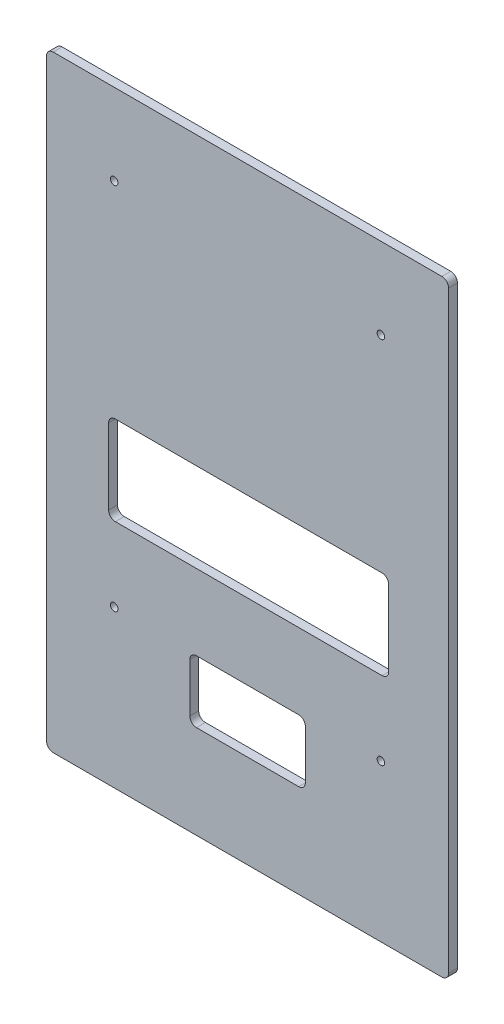
ISO-10303-21;
HEADER;
FILE_DESCRIPTION(('STEP AP214'),'2;1');
FILE_NAME('part.step','',(''),(''),'','','');
FILE_SCHEMA(('AUTOMOTIVE_DESIGN { 1 0 10303 214 1 1 1 1 }'));
ENDSEC;
DATA;
#1=APPLICATION_CONTEXT('core data for automotive mechanical design processes');
#2=APPLICATION_PROTOCOL_DEFINITION('international standard','automotive_design',2000,#1);
#3=PRODUCT_CONTEXT('',#1,'mechanical');
#4=PRODUCT('Part','Part','',(#3));
#5=PRODUCT_RELATED_PRODUCT_CATEGORY('part','',(#4));
#6=PRODUCT_DEFINITION_FORMATION('','',#4);
#7=PRODUCT_DEFINITION_CONTEXT('part definition',#1,'design');
#8=PRODUCT_DEFINITION('design','',#6,#7);
#9=PRODUCT_DEFINITION_SHAPE('','',#8);
#10=(LENGTH_UNIT() NAMED_UNIT(*) SI_UNIT(.MILLI.,.METRE.));
#11=(NAMED_UNIT(*) PLANE_ANGLE_UNIT() SI_UNIT($,.RADIAN.));
#12=(NAMED_UNIT(*) SI_UNIT($,.STERADIAN.) SOLID_ANGLE_UNIT());
#13=UNCERTAINTY_MEASURE_WITH_UNIT(LENGTH_MEASURE(1.E-05),#10,'distance_accuracy_value','');
#14=(GEOMETRIC_REPRESENTATION_CONTEXT(3) GLOBAL_UNCERTAINTY_ASSIGNED_CONTEXT((#13)) GLOBAL_UNIT_ASSIGNED_CONTEXT((#10,
#11,#12)) REPRESENTATION_CONTEXT('',''));
#15=CARTESIAN_POINT('',(0.,0.,0.));
#16=DIRECTION('',(0.,0.,1.));
#17=DIRECTION('',(1.,0.,0.));
#18=AXIS2_PLACEMENT_3D('',#15,#16,#17);
#19=CARTESIAN_POINT('',(0.,0.,4.));
#20=DIRECTION('',(0.,0.,-1.));
#21=DIRECTION('',(-1.,0.,0.));
#22=AXIS2_PLACEMENT_3D('',#19,#20,#21);
#23=PLANE('',#22);
#24=CARTESIAN_POINT('',(30.43,236.5,4.));
#25=DIRECTION('',(0.,0.,1.));
#26=DIRECTION('',(1.,0.,0.));
#27=AXIS2_PLACEMENT_3D('',#24,#25,#26);
#28=CIRCLE('',#27,1.69999999999999);
#29=CARTESIAN_POINT('',(32.13,236.5,4.));
#30=VERTEX_POINT('',#29);
#31=EDGE_CURVE('E768',#30,#30,#28,.T.);
#32=ORIENTED_EDGE('',*,*,#31,.F.);
#33=EDGE_LOOP('',(#32));
#34=FACE_BOUND('',#33,.T.);
#35=CARTESIAN_POINT('',(150.43,236.5,4.));
#36=DIRECTION('',(0.,0.,1.));
#37=DIRECTION('',(1.,0.,0.));
#38=AXIS2_PLACEMENT_3D('',#35,#36,#37);
#39=CIRCLE('',#38,1.69999999999998);
#40=CARTESIAN_POINT('',(152.13,236.5,4.));
#41=VERTEX_POINT('',#40);
#42=EDGE_CURVE('E760',#41,#41,#39,.T.);
#43=ORIENTED_EDGE('',*,*,#42,.F.);
#44=EDGE_LOOP('',(#43));
#45=FACE_BOUND('',#44,.T.);
#46=CARTESIAN_POINT('',(150.43,70.5,4.));
#47=DIRECTION('',(0.,0.,1.));
#48=DIRECTION('',(1.,0.,0.));
#49=AXIS2_PLACEMENT_3D('',#46,#47,#48);
#50=CIRCLE('',#49,1.69999999999998);
#51=CARTESIAN_POINT('',(152.13,70.5,4.));
#52=VERTEX_POINT('',#51);
#53=EDGE_CURVE('E752',#52,#52,#50,.T.);
#54=ORIENTED_EDGE('',*,*,#53,.F.);
#55=EDGE_LOOP('',(#54));
#56=FACE_BOUND('',#55,.T.);
#57=CARTESIAN_POINT('',(30.43,70.5,4.));
#58=DIRECTION('',(0.,0.,1.));
#59=DIRECTION('',(1.,0.,0.));
#60=AXIS2_PLACEMENT_3D('',#57,#58,#59);
#61=CIRCLE('',#60,1.69999999999999);
#62=CARTESIAN_POINT('',(32.13,70.5,4.));
#63=VERTEX_POINT('',#62);
#64=EDGE_CURVE('E744',#63,#63,#61,.T.);
#65=ORIENTED_EDGE('',*,*,#64,.F.);
#66=EDGE_LOOP('',(#65));
#67=FACE_BOUND('',#66,.T.);
#68=DIRECTION('',(0.,-1.,0.));
#69=VECTOR('',#68,1.);
#70=CARTESIAN_POINT('',(64.43,70.,4.));
#71=LINE('',#70,#69);
#72=CARTESIAN_POINT('',(64.43,67.,4.));
#73=VERTEX_POINT('',#72);
#74=CARTESIAN_POINT('',(64.43,45.,4.));
#75=VERTEX_POINT('',#74);
#76=EDGE_CURVE('E437',#73,#75,#71,.T.);
#77=ORIENTED_EDGE('',*,*,#76,.F.);
#78=CARTESIAN_POINT('',(67.43,67.,4.));
#79=DIRECTION('',(0.,0.,-1.));
#80=DIRECTION('',(-1.,0.,0.));
#81=AXIS2_PLACEMENT_3D('',#78,#79,#80);
#82=CIRCLE('',#81,3.);
#83=CARTESIAN_POINT('',(67.43,70.,4.));
#84=VERTEX_POINT('',#83);
#85=EDGE_CURVE('E365',#73,#84,#82,.T.);
#86=ORIENTED_EDGE('',*,*,#85,.T.);
#87=DIRECTION('',(-1.,0.,0.));
#88=VECTOR('',#87,1.);
#89=CARTESIAN_POINT('',(64.43,70.,4.));
#90=LINE('',#89,#88);
#91=CARTESIAN_POINT('',(113.43,70.,4.));
#92=VERTEX_POINT('',#91);
#93=EDGE_CURVE('E240',#92,#84,#90,.T.);
#94=ORIENTED_EDGE('',*,*,#93,.F.);
#95=CARTESIAN_POINT('',(113.43,67.,4.));
#96=DIRECTION('',(0.,0.,-1.));
#97=DIRECTION('',(-1.,0.,0.));
#98=AXIS2_PLACEMENT_3D('',#95,#96,#97);
#99=CIRCLE('',#98,3.);
#100=CARTESIAN_POINT('',(116.43,67.,4.));
#101=VERTEX_POINT('',#100);
#102=EDGE_CURVE('E359',#92,#101,#99,.T.);
#103=ORIENTED_EDGE('',*,*,#102,.T.);
#104=DIRECTION('',(0.,1.,0.));
#105=VECTOR('',#104,1.);
#106=CARTESIAN_POINT('',(116.43,70.,4.));
#107=LINE('',#106,#105);
#108=CARTESIAN_POINT('',(116.43,45.,4.));
#109=VERTEX_POINT('',#108);
#110=EDGE_CURVE('E446',#109,#101,#107,.T.);
#111=ORIENTED_EDGE('',*,*,#110,.F.);
#112=CARTESIAN_POINT('',(113.43,45.,4.));
#113=DIRECTION('',(0.,0.,-1.));
#114=DIRECTION('',(-1.,0.,0.));
#115=AXIS2_PLACEMENT_3D('',#112,#113,#114);
#116=CIRCLE('',#115,3.);
#117=CARTESIAN_POINT('',(113.43,42.,4.));
#118=VERTEX_POINT('',#117);
#119=EDGE_CURVE('E347',#109,#118,#116,.T.);
#120=ORIENTED_EDGE('',*,*,#119,.T.);
#121=DIRECTION('',(1.,0.,0.));
#122=VECTOR('',#121,1.);
#123=CARTESIAN_POINT('',(64.43,42.,4.));
#124=LINE('',#123,#122);
#125=CARTESIAN_POINT('',(67.43,42.,4.));
#126=VERTEX_POINT('',#125);
#127=EDGE_CURVE('E441',#126,#118,#124,.T.);
#128=ORIENTED_EDGE('',*,*,#127,.F.);
#129=CARTESIAN_POINT('',(67.43,45.,4.));
#130=DIRECTION('',(0.,0.,-1.));
#131=DIRECTION('',(-1.,0.,0.));
#132=AXIS2_PLACEMENT_3D('',#129,#130,#131);
#133=CIRCLE('',#132,3.);
#134=EDGE_CURVE('E353',#126,#75,#133,.T.);
#135=ORIENTED_EDGE('',*,*,#134,.T.);
#136=EDGE_LOOP('',(#77,#86,#94,#103,#111,#120,#128,#135));
#137=FACE_BOUND('',#136,.T.);
#138=DIRECTION('',(0.,-1.,0.));
#139=VECTOR('',#138,1.);
#140=CARTESIAN_POINT('',(0.,0.,4.));
#141=LINE('',#140,#139);
#142=CARTESIAN_POINT('',(0.,270.,4.));
#143=VERTEX_POINT('',#142);
#144=CARTESIAN_POINT('',(0.,3.,4.));
#145=VERTEX_POINT('',#144);
#146=EDGE_CURVE('E247',#143,#145,#141,.T.);
#147=ORIENTED_EDGE('',*,*,#146,.T.);
#148=CARTESIAN_POINT('',(3.,3.,4.));
#149=DIRECTION('',(0.,0.,-1.));
#150=DIRECTION('',(-1.,0.,0.));
#151=AXIS2_PLACEMENT_3D('',#148,#149,#150);
#152=CIRCLE('',#151,3.);
#153=CARTESIAN_POINT('',(3.,0.,4.));
#154=VERTEX_POINT('',#153);
#155=EDGE_CURVE('E272',#145,#154,#152,.F.);
#156=ORIENTED_EDGE('',*,*,#155,.T.);
#157=DIRECTION('',(1.,0.,0.));
#158=VECTOR('',#157,1.);
#159=CARTESIAN_POINT('',(0.,0.,4.));
#160=LINE('',#159,#158);
#161=CARTESIAN_POINT('',(177.86,0.,4.));
#162=VERTEX_POINT('',#161);
#163=EDGE_CURVE('E223',#154,#162,#160,.T.);
#164=ORIENTED_EDGE('',*,*,#163,.T.);
#165=CARTESIAN_POINT('',(177.86,3.,4.));
#166=DIRECTION('',(0.,0.,-1.));
#167=DIRECTION('',(-1.,0.,0.));
#168=AXIS2_PLACEMENT_3D('',#165,#166,#167);
#169=CIRCLE('',#168,3.);
#170=CARTESIAN_POINT('',(180.86,3.,4.));
#171=VERTEX_POINT('',#170);
#172=EDGE_CURVE('E269',#162,#171,#169,.F.);
#173=ORIENTED_EDGE('',*,*,#172,.T.);
#174=DIRECTION('',(0.,1.,0.));
#175=VECTOR('',#174,1.);
#176=CARTESIAN_POINT('',(180.86,0.,4.));
#177=LINE('',#176,#175);
#178=CARTESIAN_POINT('',(180.86,270.,4.));
#179=VERTEX_POINT('',#178);
#180=EDGE_CURVE('E468',#171,#179,#177,.T.);
#181=ORIENTED_EDGE('',*,*,#180,.T.);
#182=CARTESIAN_POINT('',(177.86,270.,4.));
#183=DIRECTION('',(0.,0.,-1.));
#184=DIRECTION('',(-1.,0.,0.));
#185=AXIS2_PLACEMENT_3D('',#182,#183,#184);
#186=CIRCLE('',#185,3.);
#187=CARTESIAN_POINT('',(177.86,273.,4.));
#188=VERTEX_POINT('',#187);
#189=EDGE_CURVE('E266',#179,#188,#186,.F.);
#190=ORIENTED_EDGE('',*,*,#189,.T.);
#191=DIRECTION('',(-1.,0.,0.));
#192=VECTOR('',#191,1.);
#193=CARTESIAN_POINT('',(0.,273.,4.));
#194=LINE('',#193,#192);
#195=CARTESIAN_POINT('',(3.,273.,4.));
#196=VERTEX_POINT('',#195);
#197=EDGE_CURVE('E249',#188,#196,#194,.T.);
#198=ORIENTED_EDGE('',*,*,#197,.T.);
#199=CARTESIAN_POINT('',(3.,270.,4.));
#200=DIRECTION('',(0.,0.,-1.));
#201=DIRECTION('',(-1.,0.,0.));
#202=AXIS2_PLACEMENT_3D('',#199,#200,#201);
#203=CIRCLE('',#202,3.);
#204=EDGE_CURVE('E263',#196,#143,#203,.F.);
#205=ORIENTED_EDGE('',*,*,#204,.T.);
#206=EDGE_LOOP('',(#147,#156,#164,#173,#181,#190,#198,#205));
#207=FACE_BOUND('',#206,.T.);
#208=DIRECTION('',(0.,-1.,0.));
#209=VECTOR('',#208,1.);
#210=CARTESIAN_POINT('',(27.93,144.,4.));
#211=LINE('',#210,#209);
#212=CARTESIAN_POINT('',(27.93,141.,4.));
#213=VERTEX_POINT('',#212);
#214=CARTESIAN_POINT('',(27.93,107.,4.));
#215=VERTEX_POINT('',#214);
#216=EDGE_CURVE('E411',#213,#215,#211,.T.);
#217=ORIENTED_EDGE('',*,*,#216,.F.);
#218=CARTESIAN_POINT('',(30.93,141.,4.));
#219=DIRECTION('',(0.,0.,-1.));
#220=DIRECTION('',(-1.,0.,0.));
#221=AXIS2_PLACEMENT_3D('',#218,#219,#220);
#222=CIRCLE('',#221,3.);
#223=CARTESIAN_POINT('',(30.93,144.,4.));
#224=VERTEX_POINT('',#223);
#225=EDGE_CURVE('E11',#213,#224,#222,.T.);
#226=ORIENTED_EDGE('',*,*,#225,.T.);
#227=DIRECTION('',(-1.,0.,0.));
#228=VECTOR('',#227,1.);
#229=CARTESIAN_POINT('',(27.93,144.,4.));
#230=LINE('',#229,#228);
#231=CARTESIAN_POINT('',(150.93,144.,4.));
#232=VERTEX_POINT('',#231);
#233=EDGE_CURVE('E409',#232,#224,#230,.T.);
#234=ORIENTED_EDGE('',*,*,#233,.F.);
#235=CARTESIAN_POINT('',(150.93,141.,4.));
#236=DIRECTION('',(0.,0.,-1.));
#237=DIRECTION('',(-1.,0.,0.));
#238=AXIS2_PLACEMENT_3D('',#235,#236,#237);
#239=CIRCLE('',#238,3.);
#240=CARTESIAN_POINT('',(153.93,141.,4.));
#241=VERTEX_POINT('',#240);
#242=EDGE_CURVE('E382',#232,#241,#239,.T.);
#243=ORIENTED_EDGE('',*,*,#242,.T.);
#244=DIRECTION('',(0.,1.,0.));
#245=VECTOR('',#244,1.);
#246=CARTESIAN_POINT('',(153.93,144.,4.));
#247=LINE('',#246,#245);
#248=CARTESIAN_POINT('',(153.93,107.,4.));
#249=VERTEX_POINT('',#248);
#250=EDGE_CURVE('E417',#249,#241,#247,.T.);
#251=ORIENTED_EDGE('',*,*,#250,.F.);
#252=CARTESIAN_POINT('',(150.93,107.,4.));
#253=DIRECTION('',(0.,0.,-1.));
#254=DIRECTION('',(-1.,0.,0.));
#255=AXIS2_PLACEMENT_3D('',#252,#253,#254);
#256=CIRCLE('',#255,3.);
#257=CARTESIAN_POINT('',(150.93,104.,4.));
#258=VERTEX_POINT('',#257);
#259=EDGE_CURVE('E55',#249,#258,#256,.T.);
#260=ORIENTED_EDGE('',*,*,#259,.T.);
#261=DIRECTION('',(1.,0.,0.));
#262=VECTOR('',#261,1.);
#263=CARTESIAN_POINT('',(27.93,104.,4.));
#264=LINE('',#263,#262);
#265=CARTESIAN_POINT('',(30.93,104.,4.));
#266=VERTEX_POINT('',#265);
#267=EDGE_CURVE('E425',#266,#258,#264,.T.);
#268=ORIENTED_EDGE('',*,*,#267,.F.);
#269=CARTESIAN_POINT('',(30.93,107.,4.));
#270=DIRECTION('',(0.,0.,-1.));
#271=DIRECTION('',(-1.,0.,0.));
#272=AXIS2_PLACEMENT_3D('',#269,#270,#271);
#273=CIRCLE('',#272,3.);
#274=EDGE_CURVE('E376',#266,#215,#273,.T.);
#275=ORIENTED_EDGE('',*,*,#274,.T.);
#276=EDGE_LOOP('',(#217,#226,#234,#243,#251,#260,#268,#275));
#277=FACE_BOUND('',#276,.T.);
#278=ADVANCED_FACE('F39',(#34,#45,#56,#67,#137,#207,#277),#23,.F.);
#279=CARTESIAN_POINT('',(0.,0.,0.));
#280=DIRECTION('',(0.,0.,-1.));
#281=DIRECTION('',(-1.,0.,0.));
#282=AXIS2_PLACEMENT_3D('',#279,#280,#281);
#283=PLANE('',#282);
#284=CARTESIAN_POINT('',(30.43,236.5,0.));
#285=DIRECTION('',(0.,0.,1.));
#286=DIRECTION('',(1.,0.,0.));
#287=AXIS2_PLACEMENT_3D('',#284,#285,#286);
#288=CIRCLE('',#287,1.69999999999999);
#289=CARTESIAN_POINT('',(32.13,236.5,0.));
#290=VERTEX_POINT('',#289);
#291=EDGE_CURVE('E764',#290,#290,#288,.T.);
#292=ORIENTED_EDGE('',*,*,#291,.T.);
#293=EDGE_LOOP('',(#292));
#294=FACE_BOUND('',#293,.T.);
#295=CARTESIAN_POINT('',(150.43,236.5,0.));
#296=DIRECTION('',(0.,0.,1.));
#297=DIRECTION('',(1.,0.,0.));
#298=AXIS2_PLACEMENT_3D('',#295,#296,#297);
#299=CIRCLE('',#298,1.69999999999998);
#300=CARTESIAN_POINT('',(152.13,236.5,0.));
#301=VERTEX_POINT('',#300);
#302=EDGE_CURVE('E756',#301,#301,#299,.T.);
#303=ORIENTED_EDGE('',*,*,#302,.T.);
#304=EDGE_LOOP('',(#303));
#305=FACE_BOUND('',#304,.T.);
#306=CARTESIAN_POINT('',(150.43,70.5,0.));
#307=DIRECTION('',(0.,0.,1.));
#308=DIRECTION('',(1.,0.,0.));
#309=AXIS2_PLACEMENT_3D('',#306,#307,#308);
#310=CIRCLE('',#309,1.69999999999998);
#311=CARTESIAN_POINT('',(152.13,70.5,0.));
#312=VERTEX_POINT('',#311);
#313=EDGE_CURVE('E748',#312,#312,#310,.T.);
#314=ORIENTED_EDGE('',*,*,#313,.T.);
#315=EDGE_LOOP('',(#314));
#316=FACE_BOUND('',#315,.T.);
#317=CARTESIAN_POINT('',(30.43,70.5,0.));
#318=DIRECTION('',(0.,0.,1.));
#319=DIRECTION('',(1.,0.,0.));
#320=AXIS2_PLACEMENT_3D('',#317,#318,#319);
#321=CIRCLE('',#320,1.69999999999999);
#322=CARTESIAN_POINT('',(32.13,70.5,0.));
#323=VERTEX_POINT('',#322);
#324=EDGE_CURVE('E403',#323,#323,#321,.T.);
#325=ORIENTED_EDGE('',*,*,#324,.T.);
#326=EDGE_LOOP('',(#325));
#327=FACE_BOUND('',#326,.T.);
#328=DIRECTION('',(1.,0.,0.));
#329=VECTOR('',#328,1.);
#330=CARTESIAN_POINT('',(0.,0.,0.));
#331=LINE('',#330,#329);
#332=CARTESIAN_POINT('',(3.,0.,0.));
#333=VERTEX_POINT('',#332);
#334=CARTESIAN_POINT('',(177.86,0.,0.));
#335=VERTEX_POINT('',#334);
#336=EDGE_CURVE('E220',#333,#335,#331,.T.);
#337=ORIENTED_EDGE('',*,*,#336,.F.);
#338=CARTESIAN_POINT('',(3.,3.,0.));
#339=DIRECTION('',(0.,0.,-1.));
#340=DIRECTION('',(-1.,0.,0.));
#341=AXIS2_PLACEMENT_3D('',#338,#339,#340);
#342=CIRCLE('',#341,3.);
#343=CARTESIAN_POINT('',(0.,3.,0.));
#344=VERTEX_POINT('',#343);
#345=EDGE_CURVE('E202',#333,#344,#342,.T.);
#346=ORIENTED_EDGE('',*,*,#345,.T.);
#347=DIRECTION('',(0.,-1.,0.));
#348=VECTOR('',#347,1.);
#349=CARTESIAN_POINT('',(0.,0.,0.));
#350=LINE('',#349,#348);
#351=CARTESIAN_POINT('',(0.,270.,0.));
#352=VERTEX_POINT('',#351);
#353=EDGE_CURVE('E233',#352,#344,#350,.T.);
#354=ORIENTED_EDGE('',*,*,#353,.F.);
#355=CARTESIAN_POINT('',(3.,270.,0.));
#356=DIRECTION('',(0.,0.,-1.));
#357=DIRECTION('',(-1.,0.,0.));
#358=AXIS2_PLACEMENT_3D('',#355,#356,#357);
#359=CIRCLE('',#358,3.);
#360=CARTESIAN_POINT('',(3.,273.,0.));
#361=VERTEX_POINT('',#360);
#362=EDGE_CURVE('E225',#352,#361,#359,.T.);
#363=ORIENTED_EDGE('',*,*,#362,.T.);
#364=DIRECTION('',(-1.,0.,0.));
#365=VECTOR('',#364,1.);
#366=CARTESIAN_POINT('',(0.,273.,0.));
#367=LINE('',#366,#365);
#368=CARTESIAN_POINT('',(177.86,273.,0.));
#369=VERTEX_POINT('',#368);
#370=EDGE_CURVE('E238',#369,#361,#367,.T.);
#371=ORIENTED_EDGE('',*,*,#370,.F.);
#372=CARTESIAN_POINT('',(177.86,270.,0.));
#373=DIRECTION('',(0.,0.,-1.));
#374=DIRECTION('',(-1.,0.,0.));
#375=AXIS2_PLACEMENT_3D('',#372,#373,#374);
#376=CIRCLE('',#375,3.);
#377=CARTESIAN_POINT('',(180.86,270.,0.));
#378=VERTEX_POINT('',#377);
#379=EDGE_CURVE('E253',#369,#378,#376,.T.);
#380=ORIENTED_EDGE('',*,*,#379,.T.);
#381=DIRECTION('',(0.,1.,0.));
#382=VECTOR('',#381,1.);
#383=CARTESIAN_POINT('',(180.86,0.,0.));
#384=LINE('',#383,#382);
#385=CARTESIAN_POINT('',(180.86,3.,0.));
#386=VERTEX_POINT('',#385);
#387=EDGE_CURVE('E232',#386,#378,#384,.T.);
#388=ORIENTED_EDGE('',*,*,#387,.F.);
#389=CARTESIAN_POINT('',(177.86,3.,0.));
#390=DIRECTION('',(0.,0.,-1.));
#391=DIRECTION('',(-1.,0.,0.));
#392=AXIS2_PLACEMENT_3D('',#389,#390,#391);
#393=CIRCLE('',#392,3.);
#394=EDGE_CURVE('E214',#386,#335,#393,.T.);
#395=ORIENTED_EDGE('',*,*,#394,.T.);
#396=EDGE_LOOP('',(#337,#346,#354,#363,#371,#380,#388,#395));
#397=FACE_BOUND('',#396,.T.);
#398=DIRECTION('',(0.,1.,0.));
#399=VECTOR('',#398,1.);
#400=CARTESIAN_POINT('',(116.43,70.,0.));
#401=LINE('',#400,#399);
#402=CARTESIAN_POINT('',(116.43,45.,0.));
#403=VERTEX_POINT('',#402);
#404=CARTESIAN_POINT('',(116.43,67.,0.));
#405=VERTEX_POINT('',#404);
#406=EDGE_CURVE('E456',#403,#405,#401,.T.);
#407=ORIENTED_EDGE('',*,*,#406,.T.);
#408=CARTESIAN_POINT('',(113.43,67.,0.));
#409=DIRECTION('',(0.,0.,-1.));
#410=DIRECTION('',(-1.,0.,0.));
#411=AXIS2_PLACEMENT_3D('',#408,#409,#410);
#412=CIRCLE('',#411,3.);
#413=CARTESIAN_POINT('',(113.43,70.,0.));
#414=VERTEX_POINT('',#413);
#415=EDGE_CURVE('E356',#405,#414,#412,.F.);
#416=ORIENTED_EDGE('',*,*,#415,.T.);
#417=DIRECTION('',(-1.,0.,0.));
#418=VECTOR('',#417,1.);
#419=CARTESIAN_POINT('',(64.43,70.,0.));
#420=LINE('',#419,#418);
#421=CARTESIAN_POINT('',(67.43,70.,0.));
#422=VERTEX_POINT('',#421);
#423=EDGE_CURVE('E442',#414,#422,#420,.T.);
#424=ORIENTED_EDGE('',*,*,#423,.T.);
#425=CARTESIAN_POINT('',(67.43,67.,0.));
#426=DIRECTION('',(0.,0.,-1.));
#427=DIRECTION('',(-1.,0.,0.));
#428=AXIS2_PLACEMENT_3D('',#425,#426,#427);
#429=CIRCLE('',#428,3.);
#430=CARTESIAN_POINT('',(64.43,67.,0.));
#431=VERTEX_POINT('',#430);
#432=EDGE_CURVE('E362',#422,#431,#429,.F.);
#433=ORIENTED_EDGE('',*,*,#432,.T.);
#434=DIRECTION('',(0.,-1.,0.));
#435=VECTOR('',#434,1.);
#436=CARTESIAN_POINT('',(64.43,70.,0.));
#437=LINE('',#436,#435);
#438=CARTESIAN_POINT('',(64.43,45.,0.));
#439=VERTEX_POINT('',#438);
#440=EDGE_CURVE('E416',#431,#439,#437,.T.);
#441=ORIENTED_EDGE('',*,*,#440,.T.);
#442=CARTESIAN_POINT('',(67.43,45.,0.));
#443=DIRECTION('',(0.,0.,-1.));
#444=DIRECTION('',(-1.,0.,0.));
#445=AXIS2_PLACEMENT_3D('',#442,#443,#444);
#446=CIRCLE('',#445,3.);
#447=CARTESIAN_POINT('',(67.43,42.,0.));
#448=VERTEX_POINT('',#447);
#449=EDGE_CURVE('E350',#439,#448,#446,.F.);
#450=ORIENTED_EDGE('',*,*,#449,.T.);
#451=DIRECTION('',(1.,0.,0.));
#452=VECTOR('',#451,1.);
#453=CARTESIAN_POINT('',(64.43,42.,0.));
#454=LINE('',#453,#452);
#455=CARTESIAN_POINT('',(113.43,42.,0.));
#456=VERTEX_POINT('',#455);
#457=EDGE_CURVE('E422',#448,#456,#454,.T.);
#458=ORIENTED_EDGE('',*,*,#457,.T.);
#459=CARTESIAN_POINT('',(113.43,45.,0.));
#460=DIRECTION('',(0.,0.,-1.));
#461=DIRECTION('',(-1.,0.,0.));
#462=AXIS2_PLACEMENT_3D('',#459,#460,#461);
#463=CIRCLE('',#462,3.);
#464=EDGE_CURVE('E344',#456,#403,#463,.F.);
#465=ORIENTED_EDGE('',*,*,#464,.T.);
#466=EDGE_LOOP('',(#407,#416,#424,#433,#441,#450,#458,#465));
#467=FACE_BOUND('',#466,.T.);
#468=DIRECTION('',(0.,1.,0.));
#469=VECTOR('',#468,1.);
#470=CARTESIAN_POINT('',(153.93,144.,0.));
#471=LINE('',#470,#469);
#472=CARTESIAN_POINT('',(153.93,107.,0.));
#473=VERTEX_POINT('',#472);
#474=CARTESIAN_POINT('',(153.93,141.,0.));
#475=VERTEX_POINT('',#474);
#476=EDGE_CURVE('E432',#473,#475,#471,.T.);
#477=ORIENTED_EDGE('',*,*,#476,.T.);
#478=CARTESIAN_POINT('',(150.93,141.,0.));
#479=DIRECTION('',(0.,0.,-1.));
#480=DIRECTION('',(-1.,0.,0.));
#481=AXIS2_PLACEMENT_3D('',#478,#479,#480);
#482=CIRCLE('',#481,3.);
#483=CARTESIAN_POINT('',(150.93,144.,0.));
#484=VERTEX_POINT('',#483);
#485=EDGE_CURVE('E379',#475,#484,#482,.F.);
#486=ORIENTED_EDGE('',*,*,#485,.T.);
#487=DIRECTION('',(-1.,0.,0.));
#488=VECTOR('',#487,1.);
#489=CARTESIAN_POINT('',(27.93,144.,0.));
#490=LINE('',#489,#488);
#491=CARTESIAN_POINT('',(30.93,144.,0.));
#492=VERTEX_POINT('',#491);
#493=EDGE_CURVE('E392',#484,#492,#490,.T.);
#494=ORIENTED_EDGE('',*,*,#493,.T.);
#495=CARTESIAN_POINT('',(30.93,141.,0.));
#496=DIRECTION('',(0.,0.,-1.));
#497=DIRECTION('',(-1.,0.,0.));
#498=AXIS2_PLACEMENT_3D('',#495,#496,#497);
#499=CIRCLE('',#498,3.);
#500=CARTESIAN_POINT('',(27.93,141.,0.));
#501=VERTEX_POINT('',#500);
#502=EDGE_CURVE('E48',#492,#501,#499,.F.);
#503=ORIENTED_EDGE('',*,*,#502,.T.);
#504=DIRECTION('',(0.,-1.,0.));
#505=VECTOR('',#504,1.);
#506=CARTESIAN_POINT('',(27.93,144.,0.));
#507=LINE('',#506,#505);
#508=CARTESIAN_POINT('',(27.93,107.,0.));
#509=VERTEX_POINT('',#508);
#510=EDGE_CURVE('E390',#501,#509,#507,.T.);
#511=ORIENTED_EDGE('',*,*,#510,.T.);
#512=CARTESIAN_POINT('',(30.93,107.,0.));
#513=DIRECTION('',(0.,0.,-1.));
#514=DIRECTION('',(-1.,0.,0.));
#515=AXIS2_PLACEMENT_3D('',#512,#513,#514);
#516=CIRCLE('',#515,3.);
#517=CARTESIAN_POINT('',(30.93,104.,0.));
#518=VERTEX_POINT('',#517);
#519=EDGE_CURVE('E373',#509,#518,#516,.F.);
#520=ORIENTED_EDGE('',*,*,#519,.T.);
#521=DIRECTION('',(1.,0.,0.));
#522=VECTOR('',#521,1.);
#523=CARTESIAN_POINT('',(27.93,104.,0.));
#524=LINE('',#523,#522);
#525=CARTESIAN_POINT('',(150.93,104.,0.));
#526=VERTEX_POINT('',#525);
#527=EDGE_CURVE('E402',#518,#526,#524,.T.);
#528=ORIENTED_EDGE('',*,*,#527,.T.);
#529=CARTESIAN_POINT('',(150.93,107.,0.));
#530=DIRECTION('',(0.,0.,-1.));
#531=DIRECTION('',(-1.,0.,0.));
#532=AXIS2_PLACEMENT_3D('',#529,#530,#531);
#533=CIRCLE('',#532,3.);
#534=EDGE_CURVE('E368',#526,#473,#533,.F.);
#535=ORIENTED_EDGE('',*,*,#534,.T.);
#536=EDGE_LOOP('',(#477,#486,#494,#503,#511,#520,#528,#535));
#537=FACE_BOUND('',#536,.T.);
#538=ADVANCED_FACE('F228',(#294,#305,#316,#327,#397,#467,#537),#283,.T.);
#539=CARTESIAN_POINT('',(0.,0.,4.));
#540=DIRECTION('',(1.,0.,0.));
#541=DIRECTION('',(0.,0.,-1.));
#542=AXIS2_PLACEMENT_3D('',#539,#540,#541);
#543=PLANE('',#542);
#544=ORIENTED_EDGE('',*,*,#353,.T.);
#545=DIRECTION('',(0.,0.,-1.));
#546=VECTOR('',#545,1.);
#547=CARTESIAN_POINT('',(0.,3.,4.));
#548=LINE('',#547,#546);
#549=EDGE_CURVE('E207',#344,#145,#548,.F.);
#550=ORIENTED_EDGE('',*,*,#549,.T.);
#551=ORIENTED_EDGE('',*,*,#146,.F.);
#552=DIRECTION('',(0.,0.,-1.));
#553=VECTOR('',#552,1.);
#554=CARTESIAN_POINT('',(0.,270.,4.));
#555=LINE('',#554,#553);
#556=EDGE_CURVE('E213',#143,#352,#555,.T.);
#557=ORIENTED_EDGE('',*,*,#556,.T.);
#558=EDGE_LOOP('',(#544,#550,#551,#557));
#559=FACE_BOUND('',#558,.T.);
#560=ADVANCED_FACE('F484',(#559),#543,.F.);
#561=CARTESIAN_POINT('',(0.,0.,4.));
#562=DIRECTION('',(0.,1.,0.));
#563=DIRECTION('',(0.,0.,1.));
#564=AXIS2_PLACEMENT_3D('',#561,#562,#563);
#565=PLANE('',#564);
#566=ORIENTED_EDGE('',*,*,#163,.F.);
#567=DIRECTION('',(0.,0.,-1.));
#568=VECTOR('',#567,1.);
#569=CARTESIAN_POINT('',(3.,0.,4.));
#570=LINE('',#569,#568);
#571=EDGE_CURVE('E206',#154,#333,#570,.T.);
#572=ORIENTED_EDGE('',*,*,#571,.T.);
#573=ORIENTED_EDGE('',*,*,#336,.T.);
#574=DIRECTION('',(0.,0.,-1.));
#575=VECTOR('',#574,1.);
#576=CARTESIAN_POINT('',(177.86,0.,4.));
#577=LINE('',#576,#575);
#578=EDGE_CURVE('E226',#335,#162,#577,.F.);
#579=ORIENTED_EDGE('',*,*,#578,.T.);
#580=EDGE_LOOP('',(#566,#572,#573,#579));
#581=FACE_BOUND('',#580,.T.);
#582=ADVANCED_FACE('F219',(#581),#565,.F.);
#583=CARTESIAN_POINT('',(180.86,0.,4.));
#584=DIRECTION('',(-1.,0.,0.));
#585=DIRECTION('',(0.,0.,1.));
#586=AXIS2_PLACEMENT_3D('',#583,#584,#585);
#587=PLANE('',#586);
#588=ORIENTED_EDGE('',*,*,#180,.F.);
#589=DIRECTION('',(0.,0.,-1.));
#590=VECTOR('',#589,1.);
#591=CARTESIAN_POINT('',(180.86,3.,4.));
#592=LINE('',#591,#590);
#593=EDGE_CURVE('E278',#171,#386,#592,.T.);
#594=ORIENTED_EDGE('',*,*,#593,.T.);
#595=ORIENTED_EDGE('',*,*,#387,.T.);
#596=DIRECTION('',(0.,0.,-1.));
#597=VECTOR('',#596,1.);
#598=CARTESIAN_POINT('',(180.86,270.,4.));
#599=LINE('',#598,#597);
#600=EDGE_CURVE('E275',#378,#179,#599,.F.);
#601=ORIENTED_EDGE('',*,*,#600,.T.);
#602=EDGE_LOOP('',(#588,#594,#595,#601));
#603=FACE_BOUND('',#602,.T.);
#604=ADVANCED_FACE('F492',(#603),#587,.F.);
#605=CARTESIAN_POINT('',(0.,273.,4.));
#606=DIRECTION('',(0.,-1.,0.));
#607=DIRECTION('',(0.,0.,-1.));
#608=AXIS2_PLACEMENT_3D('',#605,#606,#607);
#609=PLANE('',#608);
#610=ORIENTED_EDGE('',*,*,#197,.F.);
#611=DIRECTION('',(0.,0.,-1.));
#612=VECTOR('',#611,1.);
#613=CARTESIAN_POINT('',(177.86,273.,4.));
#614=LINE('',#613,#612);
#615=EDGE_CURVE('E340',#188,#369,#614,.T.);
#616=ORIENTED_EDGE('',*,*,#615,.T.);
#617=ORIENTED_EDGE('',*,*,#370,.T.);
#618=DIRECTION('',(0.,0.,-1.));
#619=VECTOR('',#618,1.);
#620=CARTESIAN_POINT('',(3.,273.,4.));
#621=LINE('',#620,#619);
#622=EDGE_CURVE('E337',#361,#196,#621,.F.);
#623=ORIENTED_EDGE('',*,*,#622,.T.);
#624=EDGE_LOOP('',(#610,#616,#617,#623));
#625=FACE_BOUND('',#624,.T.);
#626=ADVANCED_FACE('F486',(#625),#609,.F.);
#627=CARTESIAN_POINT('',(64.43,70.,4.));
#628=DIRECTION('',(1.,0.,0.));
#629=DIRECTION('',(0.,0.,-1.));
#630=AXIS2_PLACEMENT_3D('',#627,#628,#629);
#631=PLANE('',#630);
#632=ORIENTED_EDGE('',*,*,#76,.T.);
#633=DIRECTION('',(0.,0.,-1.));
#634=VECTOR('',#633,1.);
#635=CARTESIAN_POINT('',(64.43,45.,0.));
#636=LINE('',#635,#634);
#637=EDGE_CURVE('E299',#75,#439,#636,.T.);
#638=ORIENTED_EDGE('',*,*,#637,.T.);
#639=ORIENTED_EDGE('',*,*,#440,.F.);
#640=DIRECTION('',(0.,0.,-1.));
#641=VECTOR('',#640,1.);
#642=CARTESIAN_POINT('',(64.43,67.,4.));
#643=LINE('',#642,#641);
#644=EDGE_CURVE('E296',#431,#73,#643,.F.);
#645=ORIENTED_EDGE('',*,*,#644,.T.);
#646=EDGE_LOOP('',(#632,#638,#639,#645));
#647=FACE_BOUND('',#646,.T.);
#648=ADVANCED_FACE('F520',(#647),#631,.T.);
#649=CARTESIAN_POINT('',(64.43,42.,4.));
#650=DIRECTION('',(0.,1.,0.));
#651=DIRECTION('',(0.,0.,1.));
#652=AXIS2_PLACEMENT_3D('',#649,#650,#651);
#653=PLANE('',#652);
#654=ORIENTED_EDGE('',*,*,#127,.T.);
#655=DIRECTION('',(0.,0.,-1.));
#656=VECTOR('',#655,1.);
#657=CARTESIAN_POINT('',(113.43,42.,0.));
#658=LINE('',#657,#656);
#659=EDGE_CURVE('E285',#118,#456,#658,.T.);
#660=ORIENTED_EDGE('',*,*,#659,.T.);
#661=ORIENTED_EDGE('',*,*,#457,.F.);
#662=DIRECTION('',(0.,0.,-1.));
#663=VECTOR('',#662,1.);
#664=CARTESIAN_POINT('',(67.43,42.,4.));
#665=LINE('',#664,#663);
#666=EDGE_CURVE('E282',#448,#126,#665,.F.);
#667=ORIENTED_EDGE('',*,*,#666,.T.);
#668=EDGE_LOOP('',(#654,#660,#661,#667));
#669=FACE_BOUND('',#668,.T.);
#670=ADVANCED_FACE('F552',(#669),#653,.T.);
#671=CARTESIAN_POINT('',(116.43,70.,4.));
#672=DIRECTION('',(-1.,0.,0.));
#673=DIRECTION('',(0.,-1.,0.));
#674=AXIS2_PLACEMENT_3D('',#671,#672,#673);
#675=PLANE('',#674);
#676=ORIENTED_EDGE('',*,*,#406,.F.);
#677=DIRECTION('',(0.,0.,-1.));
#678=VECTOR('',#677,1.);
#679=CARTESIAN_POINT('',(116.43,45.,4.));
#680=LINE('',#679,#678);
#681=EDGE_CURVE('E293',#403,#109,#680,.F.);
#682=ORIENTED_EDGE('',*,*,#681,.T.);
#683=ORIENTED_EDGE('',*,*,#110,.T.);
#684=DIRECTION('',(0.,0.,-1.));
#685=VECTOR('',#684,1.);
#686=CARTESIAN_POINT('',(116.43,67.,0.));
#687=LINE('',#686,#685);
#688=EDGE_CURVE('E289',#101,#405,#687,.T.);
#689=ORIENTED_EDGE('',*,*,#688,.T.);
#690=EDGE_LOOP('',(#676,#682,#683,#689));
#691=FACE_BOUND('',#690,.T.);
#692=ADVANCED_FACE('F559',(#691),#675,.T.);
#693=CARTESIAN_POINT('',(64.43,70.,4.));
#694=DIRECTION('',(0.,-1.,0.));
#695=DIRECTION('',(0.,0.,-1.));
#696=AXIS2_PLACEMENT_3D('',#693,#694,#695);
#697=PLANE('',#696);
#698=ORIENTED_EDGE('',*,*,#423,.F.);
#699=DIRECTION('',(0.,0.,-1.));
#700=VECTOR('',#699,1.);
#701=CARTESIAN_POINT('',(113.43,70.,4.));
#702=LINE('',#701,#700);
#703=EDGE_CURVE('E307',#414,#92,#702,.F.);
#704=ORIENTED_EDGE('',*,*,#703,.T.);
#705=ORIENTED_EDGE('',*,*,#93,.T.);
#706=DIRECTION('',(0.,0.,-1.));
#707=VECTOR('',#706,1.);
#708=CARTESIAN_POINT('',(67.43,70.,0.));
#709=LINE('',#708,#707);
#710=EDGE_CURVE('E303',#84,#422,#709,.T.);
#711=ORIENTED_EDGE('',*,*,#710,.T.);
#712=EDGE_LOOP('',(#698,#704,#705,#711));
#713=FACE_BOUND('',#712,.T.);
#714=ADVANCED_FACE('F566',(#713),#697,.T.);
#715=CARTESIAN_POINT('',(27.93,144.,4.));
#716=DIRECTION('',(1.,0.,0.));
#717=DIRECTION('',(0.,1.,0.));
#718=AXIS2_PLACEMENT_3D('',#715,#716,#717);
#719=PLANE('',#718);
#720=ORIENTED_EDGE('',*,*,#216,.T.);
#721=DIRECTION('',(0.,0.,-1.));
#722=VECTOR('',#721,1.);
#723=CARTESIAN_POINT('',(27.93,107.,0.));
#724=LINE('',#723,#722);
#725=EDGE_CURVE('E326',#215,#509,#724,.T.);
#726=ORIENTED_EDGE('',*,*,#725,.T.);
#727=ORIENTED_EDGE('',*,*,#510,.F.);
#728=DIRECTION('',(0.,0.,-1.));
#729=VECTOR('',#728,1.);
#730=CARTESIAN_POINT('',(27.93,141.,4.));
#731=LINE('',#730,#729);
#732=EDGE_CURVE('E323',#501,#213,#731,.F.);
#733=ORIENTED_EDGE('',*,*,#732,.T.);
#734=EDGE_LOOP('',(#720,#726,#727,#733));
#735=FACE_BOUND('',#734,.T.);
#736=ADVANCED_FACE('F398',(#735),#719,.T.);
#737=CARTESIAN_POINT('',(27.93,104.,4.));
#738=DIRECTION('',(0.,1.,0.));
#739=DIRECTION('',(0.,0.,1.));
#740=AXIS2_PLACEMENT_3D('',#737,#738,#739);
#741=PLANE('',#740);
#742=ORIENTED_EDGE('',*,*,#267,.T.);
#743=DIRECTION('',(0.,0.,-1.));
#744=VECTOR('',#743,1.);
#745=CARTESIAN_POINT('',(150.93,104.,0.));
#746=LINE('',#745,#744);
#747=EDGE_CURVE('E312',#258,#526,#746,.T.);
#748=ORIENTED_EDGE('',*,*,#747,.T.);
#749=ORIENTED_EDGE('',*,*,#527,.F.);
#750=DIRECTION('',(0.,0.,-1.));
#751=VECTOR('',#750,1.);
#752=CARTESIAN_POINT('',(30.93,104.,4.));
#753=LINE('',#752,#751);
#754=EDGE_CURVE('E62',#518,#266,#753,.F.);
#755=ORIENTED_EDGE('',*,*,#754,.T.);
#756=EDGE_LOOP('',(#742,#748,#749,#755));
#757=FACE_BOUND('',#756,.T.);
#758=ADVANCED_FACE('F581',(#757),#741,.T.);
#759=CARTESIAN_POINT('',(153.93,144.,4.));
#760=DIRECTION('',(-1.,0.,0.));
#761=DIRECTION('',(0.,0.,1.));
#762=AXIS2_PLACEMENT_3D('',#759,#760,#761);
#763=PLANE('',#762);
#764=ORIENTED_EDGE('',*,*,#476,.F.);
#765=DIRECTION('',(0.,0.,-1.));
#766=VECTOR('',#765,1.);
#767=CARTESIAN_POINT('',(153.93,107.,4.));
#768=LINE('',#767,#766);
#769=EDGE_CURVE('E320',#473,#249,#768,.F.);
#770=ORIENTED_EDGE('',*,*,#769,.T.);
#771=ORIENTED_EDGE('',*,*,#250,.T.);
#772=DIRECTION('',(0.,0.,-1.));
#773=VECTOR('',#772,1.);
#774=CARTESIAN_POINT('',(153.93,141.,0.));
#775=LINE('',#774,#773);
#776=EDGE_CURVE('E316',#241,#475,#775,.T.);
#777=ORIENTED_EDGE('',*,*,#776,.T.);
#778=EDGE_LOOP('',(#764,#770,#771,#777));
#779=FACE_BOUND('',#778,.T.);
#780=ADVANCED_FACE('F588',(#779),#763,.T.);
#781=CARTESIAN_POINT('',(27.93,144.,4.));
#782=DIRECTION('',(0.,-1.,0.));
#783=DIRECTION('',(0.,0.,-1.));
#784=AXIS2_PLACEMENT_3D('',#781,#782,#783);
#785=PLANE('',#784);
#786=ORIENTED_EDGE('',*,*,#493,.F.);
#787=DIRECTION('',(0.,0.,-1.));
#788=VECTOR('',#787,1.);
#789=CARTESIAN_POINT('',(150.93,144.,4.));
#790=LINE('',#789,#788);
#791=EDGE_CURVE('E334',#484,#232,#790,.F.);
#792=ORIENTED_EDGE('',*,*,#791,.T.);
#793=ORIENTED_EDGE('',*,*,#233,.T.);
#794=DIRECTION('',(0.,0.,-1.));
#795=VECTOR('',#794,1.);
#796=CARTESIAN_POINT('',(30.93,144.,0.));
#797=LINE('',#796,#795);
#798=EDGE_CURVE('E330',#224,#492,#797,.T.);
#799=ORIENTED_EDGE('',*,*,#798,.T.);
#800=EDGE_LOOP('',(#786,#792,#793,#799));
#801=FACE_BOUND('',#800,.T.);
#802=ADVANCED_FACE('F413',(#801),#785,.T.);
#803=CARTESIAN_POINT('',(30.43,70.5,4.));
#804=DIRECTION('',(0.,0.,1.));
#805=DIRECTION('',(1.,0.,0.));
#806=AXIS2_PLACEMENT_3D('',#803,#804,#805);
#807=CYLINDRICAL_SURFACE('',#806,1.69999999999999);
#808=ORIENTED_EDGE('',*,*,#324,.F.);
#809=EDGE_LOOP('',(#808));
#810=FACE_BOUND('',#809,.T.);
#811=ORIENTED_EDGE('',*,*,#64,.T.);
#812=EDGE_LOOP('',(#811));
#813=FACE_BOUND('',#812,.T.);
#814=ADVANCED_FACE('F602',(#810,#813),#807,.F.);
#815=CARTESIAN_POINT('',(150.43,70.5,4.));
#816=DIRECTION('',(0.,0.,1.));
#817=DIRECTION('',(1.,0.,0.));
#818=AXIS2_PLACEMENT_3D('',#815,#816,#817);
#819=CYLINDRICAL_SURFACE('',#818,1.69999999999998);
#820=ORIENTED_EDGE('',*,*,#313,.F.);
#821=EDGE_LOOP('',(#820));
#822=FACE_BOUND('',#821,.T.);
#823=ORIENTED_EDGE('',*,*,#53,.T.);
#824=EDGE_LOOP('',(#823));
#825=FACE_BOUND('',#824,.T.);
#826=ADVANCED_FACE('F610',(#822,#825),#819,.F.);
#827=CARTESIAN_POINT('',(150.43,236.5,4.));
#828=DIRECTION('',(0.,0.,1.));
#829=DIRECTION('',(1.,0.,0.));
#830=AXIS2_PLACEMENT_3D('',#827,#828,#829);
#831=CYLINDRICAL_SURFACE('',#830,1.69999999999998);
#832=ORIENTED_EDGE('',*,*,#302,.F.);
#833=EDGE_LOOP('',(#832));
#834=FACE_BOUND('',#833,.T.);
#835=ORIENTED_EDGE('',*,*,#42,.T.);
#836=EDGE_LOOP('',(#835));
#837=FACE_BOUND('',#836,.T.);
#838=ADVANCED_FACE('F618',(#834,#837),#831,.F.);
#839=CARTESIAN_POINT('',(30.43,236.5,4.));
#840=DIRECTION('',(0.,0.,1.));
#841=DIRECTION('',(1.,0.,0.));
#842=AXIS2_PLACEMENT_3D('',#839,#840,#841);
#843=CYLINDRICAL_SURFACE('',#842,1.69999999999999);
#844=ORIENTED_EDGE('',*,*,#291,.F.);
#845=EDGE_LOOP('',(#844));
#846=FACE_BOUND('',#845,.T.);
#847=ORIENTED_EDGE('',*,*,#31,.T.);
#848=EDGE_LOOP('',(#847));
#849=FACE_BOUND('',#848,.T.);
#850=ADVANCED_FACE('F507',(#846,#849),#843,.F.);
#851=CARTESIAN_POINT('',(3.,3.,4.));
#852=DIRECTION('',(0.,0.,-1.));
#853=DIRECTION('',(-1.,0.,0.));
#854=AXIS2_PLACEMENT_3D('',#851,#852,#853);
#855=CYLINDRICAL_SURFACE('',#854,3.);
#856=ORIENTED_EDGE('',*,*,#155,.F.);
#857=ORIENTED_EDGE('',*,*,#549,.F.);
#858=ORIENTED_EDGE('',*,*,#345,.F.);
#859=ORIENTED_EDGE('',*,*,#571,.F.);
#860=EDGE_LOOP('',(#856,#857,#858,#859));
#861=FACE_BOUND('',#860,.T.);
#862=ADVANCED_FACE('F205',(#861),#855,.T.);
#863=CARTESIAN_POINT('',(177.86,3.,4.));
#864=DIRECTION('',(0.,0.,-1.));
#865=DIRECTION('',(-1.,0.,0.));
#866=AXIS2_PLACEMENT_3D('',#863,#864,#865);
#867=CYLINDRICAL_SURFACE('',#866,3.);
#868=ORIENTED_EDGE('',*,*,#172,.F.);
#869=ORIENTED_EDGE('',*,*,#578,.F.);
#870=ORIENTED_EDGE('',*,*,#394,.F.);
#871=ORIENTED_EDGE('',*,*,#593,.F.);
#872=EDGE_LOOP('',(#868,#869,#870,#871));
#873=FACE_BOUND('',#872,.T.);
#874=ADVANCED_FACE('F496',(#873),#867,.T.);
#875=CARTESIAN_POINT('',(113.43,45.,4.));
#876=DIRECTION('',(0.,0.,1.));
#877=DIRECTION('',(1.,0.,0.));
#878=AXIS2_PLACEMENT_3D('',#875,#876,#877);
#879=CYLINDRICAL_SURFACE('',#878,3.);
#880=ORIENTED_EDGE('',*,*,#119,.F.);
#881=ORIENTED_EDGE('',*,*,#681,.F.);
#882=ORIENTED_EDGE('',*,*,#464,.F.);
#883=ORIENTED_EDGE('',*,*,#659,.F.);
#884=EDGE_LOOP('',(#880,#881,#882,#883));
#885=FACE_BOUND('',#884,.T.);
#886=ADVANCED_FACE('F498',(#885),#879,.F.);
#887=CARTESIAN_POINT('',(67.43,45.,4.));
#888=DIRECTION('',(0.,0.,1.));
#889=DIRECTION('',(1.,0.,0.));
#890=AXIS2_PLACEMENT_3D('',#887,#888,#889);
#891=CYLINDRICAL_SURFACE('',#890,3.);
#892=ORIENTED_EDGE('',*,*,#134,.F.);
#893=ORIENTED_EDGE('',*,*,#666,.F.);
#894=ORIENTED_EDGE('',*,*,#449,.F.);
#895=ORIENTED_EDGE('',*,*,#637,.F.);
#896=EDGE_LOOP('',(#892,#893,#894,#895));
#897=FACE_BOUND('',#896,.T.);
#898=ADVANCED_FACE('F504',(#897),#891,.F.);
#899=CARTESIAN_POINT('',(113.43,67.,4.));
#900=DIRECTION('',(0.,0.,1.));
#901=DIRECTION('',(1.,0.,0.));
#902=AXIS2_PLACEMENT_3D('',#899,#900,#901);
#903=CYLINDRICAL_SURFACE('',#902,3.);
#904=ORIENTED_EDGE('',*,*,#102,.F.);
#905=ORIENTED_EDGE('',*,*,#703,.F.);
#906=ORIENTED_EDGE('',*,*,#415,.F.);
#907=ORIENTED_EDGE('',*,*,#688,.F.);
#908=EDGE_LOOP('',(#904,#905,#906,#907));
#909=FACE_BOUND('',#908,.T.);
#910=ADVANCED_FACE('F656',(#909),#903,.F.);
#911=CARTESIAN_POINT('',(67.43,67.,4.));
#912=DIRECTION('',(0.,0.,1.));
#913=DIRECTION('',(1.,0.,0.));
#914=AXIS2_PLACEMENT_3D('',#911,#912,#913);
#915=CYLINDRICAL_SURFACE('',#914,3.);
#916=ORIENTED_EDGE('',*,*,#85,.F.);
#917=ORIENTED_EDGE('',*,*,#644,.F.);
#918=ORIENTED_EDGE('',*,*,#432,.F.);
#919=ORIENTED_EDGE('',*,*,#710,.F.);
#920=EDGE_LOOP('',(#916,#917,#918,#919));
#921=FACE_BOUND('',#920,.T.);
#922=ADVANCED_FACE('F666',(#921),#915,.F.);
#923=CARTESIAN_POINT('',(150.93,107.,4.));
#924=DIRECTION('',(0.,0.,1.));
#925=DIRECTION('',(1.,0.,0.));
#926=AXIS2_PLACEMENT_3D('',#923,#924,#925);
#927=CYLINDRICAL_SURFACE('',#926,3.);
#928=ORIENTED_EDGE('',*,*,#259,.F.);
#929=ORIENTED_EDGE('',*,*,#769,.F.);
#930=ORIENTED_EDGE('',*,*,#534,.F.);
#931=ORIENTED_EDGE('',*,*,#747,.F.);
#932=EDGE_LOOP('',(#928,#929,#930,#931));
#933=FACE_BOUND('',#932,.T.);
#934=ADVANCED_FACE('F676',(#933),#927,.F.);
#935=CARTESIAN_POINT('',(30.93,107.,4.));
#936=DIRECTION('',(0.,0.,1.));
#937=DIRECTION('',(1.,0.,0.));
#938=AXIS2_PLACEMENT_3D('',#935,#936,#937);
#939=CYLINDRICAL_SURFACE('',#938,3.);
#940=ORIENTED_EDGE('',*,*,#274,.F.);
#941=ORIENTED_EDGE('',*,*,#754,.F.);
#942=ORIENTED_EDGE('',*,*,#519,.F.);
#943=ORIENTED_EDGE('',*,*,#725,.F.);
#944=EDGE_LOOP('',(#940,#941,#942,#943));
#945=FACE_BOUND('',#944,.T.);
#946=ADVANCED_FACE('F686',(#945),#939,.F.);
#947=CARTESIAN_POINT('',(150.93,141.,4.));
#948=DIRECTION('',(0.,0.,1.));
#949=DIRECTION('',(1.,0.,0.));
#950=AXIS2_PLACEMENT_3D('',#947,#948,#949);
#951=CYLINDRICAL_SURFACE('',#950,3.);
#952=ORIENTED_EDGE('',*,*,#242,.F.);
#953=ORIENTED_EDGE('',*,*,#791,.F.);
#954=ORIENTED_EDGE('',*,*,#485,.F.);
#955=ORIENTED_EDGE('',*,*,#776,.F.);
#956=EDGE_LOOP('',(#952,#953,#954,#955));
#957=FACE_BOUND('',#956,.T.);
#958=ADVANCED_FACE('F696',(#957),#951,.F.);
#959=CARTESIAN_POINT('',(30.93,141.,4.));
#960=DIRECTION('',(0.,0.,1.));
#961=DIRECTION('',(1.,0.,0.));
#962=AXIS2_PLACEMENT_3D('',#959,#960,#961);
#963=CYLINDRICAL_SURFACE('',#962,3.);
#964=ORIENTED_EDGE('',*,*,#225,.F.);
#965=ORIENTED_EDGE('',*,*,#732,.F.);
#966=ORIENTED_EDGE('',*,*,#502,.F.);
#967=ORIENTED_EDGE('',*,*,#798,.F.);
#968=EDGE_LOOP('',(#964,#965,#966,#967));
#969=FACE_BOUND('',#968,.T.);
#970=ADVANCED_FACE('F406',(#969),#963,.F.);
#971=CARTESIAN_POINT('',(177.86,270.,4.));
#972=DIRECTION('',(0.,0.,-1.));
#973=DIRECTION('',(-1.,0.,0.));
#974=AXIS2_PLACEMENT_3D('',#971,#972,#973);
#975=CYLINDRICAL_SURFACE('',#974,3.);
#976=ORIENTED_EDGE('',*,*,#189,.F.);
#977=ORIENTED_EDGE('',*,*,#600,.F.);
#978=ORIENTED_EDGE('',*,*,#379,.F.);
#979=ORIENTED_EDGE('',*,*,#615,.F.);
#980=EDGE_LOOP('',(#976,#977,#978,#979));
#981=FACE_BOUND('',#980,.T.);
#982=ADVANCED_FACE('F488',(#981),#975,.T.);
#983=CARTESIAN_POINT('',(3.,270.,4.));
#984=DIRECTION('',(0.,0.,-1.));
#985=DIRECTION('',(-1.,0.,0.));
#986=AXIS2_PLACEMENT_3D('',#983,#984,#985);
#987=CYLINDRICAL_SURFACE('',#986,3.);
#988=ORIENTED_EDGE('',*,*,#204,.F.);
#989=ORIENTED_EDGE('',*,*,#622,.F.);
#990=ORIENTED_EDGE('',*,*,#362,.F.);
#991=ORIENTED_EDGE('',*,*,#556,.F.);
#992=EDGE_LOOP('',(#988,#989,#990,#991));
#993=FACE_BOUND('',#992,.T.);
#994=ADVANCED_FACE('F41',(#993),#987,.T.);
#995=CLOSED_SHELL('',(#278,#538,#560,#582,#604,#626,#648,#670,#692,#714,#736,#758,#780,#802,
#814,#826,#838,#850,#862,#874,#886,#898,#910,#922,#934,#946,#958,#970,#982,#994));
#996=MANIFOLD_SOLID_BREP('B2',#995);
#997=ADVANCED_BREP_SHAPE_REPRESENTATION('',(#18,#996),#14);
#998=SHAPE_DEFINITION_REPRESENTATION(#9,#997);
ENDSEC;
END-ISO-10303-21;
